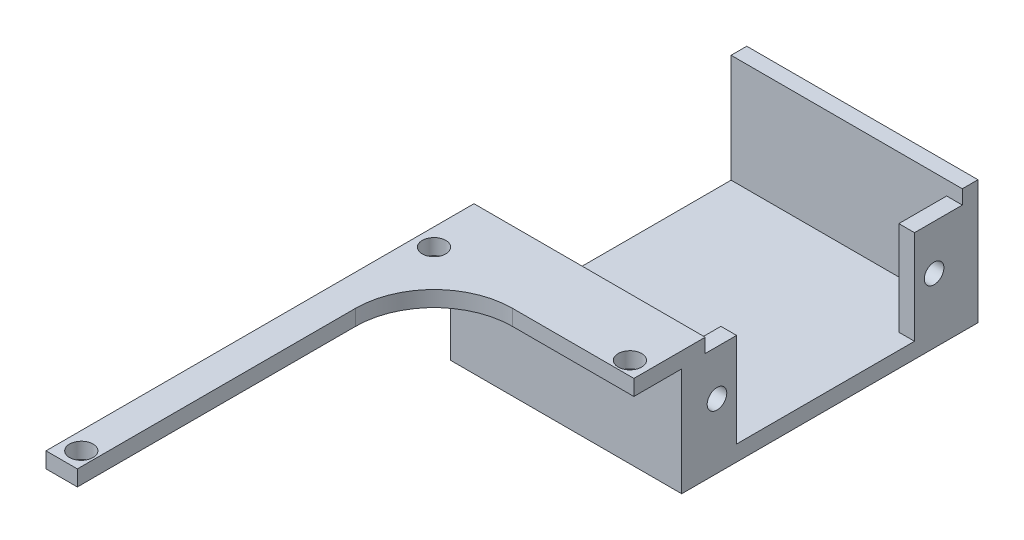
ISO-10303-21;
HEADER;
FILE_DESCRIPTION(('STEP AP214'),'2;1');
FILE_NAME('part.step','',(''),(''),'','','');
FILE_SCHEMA(('AUTOMOTIVE_DESIGN { 1 0 10303 214 1 1 1 1 }'));
ENDSEC;
DATA;
#1=APPLICATION_CONTEXT('core data for automotive mechanical design processes');
#2=APPLICATION_PROTOCOL_DEFINITION('international standard','automotive_design',2000,#1);
#3=PRODUCT_CONTEXT('',#1,'mechanical');
#4=PRODUCT('Part','Part','',(#3));
#5=PRODUCT_RELATED_PRODUCT_CATEGORY('part','',(#4));
#6=PRODUCT_DEFINITION_FORMATION('','',#4);
#7=PRODUCT_DEFINITION_CONTEXT('part definition',#1,'design');
#8=PRODUCT_DEFINITION('design','',#6,#7);
#9=PRODUCT_DEFINITION_SHAPE('','',#8);
#10=(LENGTH_UNIT() NAMED_UNIT(*) SI_UNIT(.MILLI.,.METRE.));
#11=(NAMED_UNIT(*) PLANE_ANGLE_UNIT() SI_UNIT($,.RADIAN.));
#12=(NAMED_UNIT(*) SI_UNIT($,.STERADIAN.) SOLID_ANGLE_UNIT());
#13=UNCERTAINTY_MEASURE_WITH_UNIT(LENGTH_MEASURE(1.E-05),#10,'distance_accuracy_value','');
#14=(GEOMETRIC_REPRESENTATION_CONTEXT(3) GLOBAL_UNCERTAINTY_ASSIGNED_CONTEXT((#13)) GLOBAL_UNIT_ASSIGNED_CONTEXT((#10,
#11,#12)) REPRESENTATION_CONTEXT('',''));
#15=CARTESIAN_POINT('',(0.,0.,0.));
#16=DIRECTION('',(0.,0.,1.));
#17=DIRECTION('',(1.,0.,0.));
#18=AXIS2_PLACEMENT_3D('',#15,#16,#17);
#19=CARTESIAN_POINT('',(-11.734375,-11.8,-56.7984375));
#20=DIRECTION('',(0.,-1.,0.));
#21=DIRECTION('',(0.,0.,-1.));
#22=AXIS2_PLACEMENT_3D('',#19,#20,#21);
#23=PLANE('',#22);
#24=DIRECTION('',(0.,0.,1.));
#25=VECTOR('',#24,1.);
#26=CARTESIAN_POINT('',(-13.734375,-11.8,-54.7984375));
#27=LINE('',#26,#25);
#28=CARTESIAN_POINT('',(-13.734375,-11.8,-54.7984375));
#29=VERTEX_POINT('',#28);
#30=CARTESIAN_POINT('',(-13.734375,-11.8,-48.6984375));
#31=VERTEX_POINT('',#30);
#32=EDGE_CURVE('E230',#29,#31,#27,.T.);
#33=ORIENTED_EDGE('',*,*,#32,.F.);
#34=DIRECTION('',(1.,0.,0.));
#35=VECTOR('',#34,1.);
#36=CARTESIAN_POINT('',(-41.234375,-11.8,-54.7984375));
#37=LINE('',#36,#35);
#38=CARTESIAN_POINT('',(-41.234375,-11.8,-54.7984375));
#39=VERTEX_POINT('',#38);
#40=EDGE_CURVE('E203',#39,#29,#37,.T.);
#41=ORIENTED_EDGE('',*,*,#40,.F.);
#42=DIRECTION('',(0.,0.,1.));
#43=VECTOR('',#42,1.);
#44=CARTESIAN_POINT('',(-41.234375,-11.8,-56.7984375));
#45=LINE('',#44,#43);
#46=CARTESIAN_POINT('',(-41.234375,-11.8,-21.9984375));
#47=VERTEX_POINT('',#46);
#48=EDGE_CURVE('E313',#39,#47,#45,.T.);
#49=ORIENTED_EDGE('',*,*,#48,.T.);
#50=DIRECTION('',(1.,0.,0.));
#51=VECTOR('',#50,1.);
#52=CARTESIAN_POINT('',(-11.734375,-11.8,-21.9984375));
#53=LINE('',#52,#51);
#54=CARTESIAN_POINT('',(-13.734375,-11.8,-21.9984375));
#55=VERTEX_POINT('',#54);
#56=EDGE_CURVE('E296',#47,#55,#53,.T.);
#57=ORIENTED_EDGE('',*,*,#56,.T.);
#58=DIRECTION('',(0.,0.,1.));
#59=VECTOR('',#58,1.);
#60=CARTESIAN_POINT('',(-13.734375,-11.8,-21.9984375));
#61=LINE('',#60,#59);
#62=CARTESIAN_POINT('',(-13.734375,-11.8,-25.9984375));
#63=VERTEX_POINT('',#62);
#64=EDGE_CURVE('E245',#63,#55,#61,.T.);
#65=ORIENTED_EDGE('',*,*,#64,.F.);
#66=DIRECTION('',(-1.,0.,0.));
#67=VECTOR('',#66,1.);
#68=CARTESIAN_POINT('',(-11.734375,-11.8,-25.9984375));
#69=LINE('',#68,#67);
#70=CARTESIAN_POINT('',(-11.734375,-11.8,-25.9984375));
#71=VERTEX_POINT('',#70);
#72=EDGE_CURVE('E207',#71,#63,#69,.T.);
#73=ORIENTED_EDGE('',*,*,#72,.F.);
#74=DIRECTION('',(0.,0.,1.));
#75=VECTOR('',#74,1.);
#76=CARTESIAN_POINT('',(-11.734375,-11.8,-56.7984375));
#77=LINE('',#76,#75);
#78=CARTESIAN_POINT('',(-11.734375,-11.8,-48.6984375));
#79=VERTEX_POINT('',#78);
#80=EDGE_CURVE('E88',#79,#71,#77,.T.);
#81=ORIENTED_EDGE('',*,*,#80,.F.);
#82=DIRECTION('',(1.,0.,0.));
#83=VECTOR('',#82,1.);
#84=CARTESIAN_POINT('',(-11.734375,-11.8,-48.6984375));
#85=LINE('',#84,#83);
#86=EDGE_CURVE('E83',#31,#79,#85,.T.);
#87=ORIENTED_EDGE('',*,*,#86,.F.);
#88=EDGE_LOOP('',(#33,#41,#49,#57,#65,#73,#81,#87));
#89=FACE_BOUND('',#88,.T.);
#90=ADVANCED_FACE('F65',(#89),#23,.F.);
#91=CARTESIAN_POINT('',(-41.234375,2.,-54.7984375));
#92=DIRECTION('',(0.,0.,-1.));
#93=DIRECTION('',(-1.,0.,0.));
#94=AXIS2_PLACEMENT_3D('',#91,#92,#93);
#95=PLANE('',#94);
#96=DIRECTION('',(0.,-1.,0.));
#97=VECTOR('',#96,1.);
#98=CARTESIAN_POINT('',(-13.734375,0.200000000000001,-54.7984375));
#99=LINE('',#98,#97);
#100=CARTESIAN_POINT('',(-13.734375,0.200000000000001,-54.7984375));
#101=VERTEX_POINT('',#100);
#102=EDGE_CURVE('E196',#101,#29,#99,.T.);
#103=ORIENTED_EDGE('',*,*,#102,.F.);
#104=DIRECTION('',(-1.,0.,0.));
#105=VECTOR('',#104,1.);
#106=CARTESIAN_POINT('',(-11.734375,0.200000000000001,-54.7984375));
#107=LINE('',#106,#105);
#108=CARTESIAN_POINT('',(-11.734375,0.200000000000001,-54.7984375));
#109=VERTEX_POINT('',#108);
#110=EDGE_CURVE('E200',#109,#101,#107,.T.);
#111=ORIENTED_EDGE('',*,*,#110,.F.);
#112=DIRECTION('',(0.,-1.,0.));
#113=VECTOR('',#112,1.);
#114=CARTESIAN_POINT('',(-11.734375,2.,-54.7984375));
#115=LINE('',#114,#113);
#116=CARTESIAN_POINT('',(-11.734375,2.,-54.7984375));
#117=VERTEX_POINT('',#116);
#118=EDGE_CURVE('E288',#117,#109,#115,.T.);
#119=ORIENTED_EDGE('',*,*,#118,.F.);
#120=DIRECTION('',(1.,0.,0.));
#121=VECTOR('',#120,1.);
#122=CARTESIAN_POINT('',(-41.234375,2.,-54.7984375));
#123=LINE('',#122,#121);
#124=CARTESIAN_POINT('',(-41.234375,2.,-54.7984375));
#125=VERTEX_POINT('',#124);
#126=EDGE_CURVE('E277',#125,#117,#123,.T.);
#127=ORIENTED_EDGE('',*,*,#126,.F.);
#128=DIRECTION('',(0.,-1.,0.));
#129=VECTOR('',#128,1.);
#130=CARTESIAN_POINT('',(-41.234375,2.,-54.7984375));
#131=LINE('',#130,#129);
#132=EDGE_CURVE('E293',#125,#39,#131,.T.);
#133=ORIENTED_EDGE('',*,*,#132,.T.);
#134=ORIENTED_EDGE('',*,*,#40,.T.);
#135=EDGE_LOOP('',(#103,#111,#119,#127,#133,#134));
#136=FACE_BOUND('',#135,.T.);
#137=ADVANCED_FACE('F198',(#136),#95,.F.);
#138=CARTESIAN_POINT('',(0.,0.,-21.9984375));
#139=DIRECTION('',(0.,0.,-1.));
#140=DIRECTION('',(-1.,0.,0.));
#141=AXIS2_PLACEMENT_3D('',#138,#139,#140);
#142=PLANE('',#141);
#143=DIRECTION('',(1.,0.,0.));
#144=VECTOR('',#143,1.);
#145=CARTESIAN_POINT('',(-11.734375,0.200000000000001,-21.9984375));
#146=LINE('',#145,#144);
#147=CARTESIAN_POINT('',(-13.734375,0.200000000000001,-21.9984375));
#148=VERTEX_POINT('',#147);
#149=CARTESIAN_POINT('',(-11.734375,0.200000000000001,-21.9984375));
#150=VERTEX_POINT('',#149);
#151=EDGE_CURVE('E252',#148,#150,#146,.T.);
#152=ORIENTED_EDGE('',*,*,#151,.F.);
#153=DIRECTION('',(0.,-1.,0.));
#154=VECTOR('',#153,1.);
#155=CARTESIAN_POINT('',(-13.734375,0.200000000000001,-21.9984375));
#156=LINE('',#155,#154);
#157=EDGE_CURVE('E256',#148,#55,#156,.T.);
#158=ORIENTED_EDGE('',*,*,#157,.T.);
#159=ORIENTED_EDGE('',*,*,#56,.F.);
#160=DIRECTION('',(0.,1.,0.));
#161=VECTOR('',#160,1.);
#162=CARTESIAN_POINT('',(-41.234375,0.,-21.9984375));
#163=LINE('',#162,#161);
#164=CARTESIAN_POINT('',(-41.234375,2.,-21.9984375));
#165=VERTEX_POINT('',#164);
#166=EDGE_CURVE('E341',#47,#165,#163,.T.);
#167=ORIENTED_EDGE('',*,*,#166,.T.);
#168=DIRECTION('',(1.,0.,0.));
#169=VECTOR('',#168,1.);
#170=CARTESIAN_POINT('',(-41.234375,2.,-21.9984375));
#171=LINE('',#170,#169);
#172=CARTESIAN_POINT('',(-11.734375,2.,-21.9984375));
#173=VERTEX_POINT('',#172);
#174=EDGE_CURVE('E344',#165,#173,#171,.T.);
#175=ORIENTED_EDGE('',*,*,#174,.T.);
#176=DIRECTION('',(0.,-1.,0.));
#177=VECTOR('',#176,1.);
#178=CARTESIAN_POINT('',(-11.734375,2.,-21.9984375));
#179=LINE('',#178,#177);
#180=EDGE_CURVE('E338',#173,#150,#179,.T.);
#181=ORIENTED_EDGE('',*,*,#180,.T.);
#182=EDGE_LOOP('',(#152,#158,#159,#167,#175,#181));
#183=FACE_BOUND('',#182,.T.);
#184=ADVANCED_FACE('F474',(#183),#142,.T.);
#185=CARTESIAN_POINT('',(0.,0.,0.));
#186=DIRECTION('',(0.,1.,0.));
#187=DIRECTION('',(0.,0.,1.));
#188=AXIS2_PLACEMENT_3D('',#185,#186,#187);
#189=PLANE('',#188);
#190=CARTESIAN_POINT('',(-13.984375,0.,-14.6484375));
#191=DIRECTION('',(0.,1.,0.));
#192=DIRECTION('',(0.,0.,1.));
#193=AXIS2_PLACEMENT_3D('',#190,#191,#192);
#194=CIRCLE('',#193,1.5);
#195=CARTESIAN_POINT('',(-13.984375,0.,-13.1484375));
#196=VERTEX_POINT('',#195);
#197=EDGE_CURVE('E366',#196,#196,#194,.T.);
#198=ORIENTED_EDGE('',*,*,#197,.T.);
#199=EDGE_LOOP('',(#198));
#200=FACE_BOUND('',#199,.T.);
#201=CARTESIAN_POINT('',(-38.984375,0.,-14.6484375));
#202=DIRECTION('',(0.,1.,0.));
#203=DIRECTION('',(0.,0.,1.));
#204=AXIS2_PLACEMENT_3D('',#201,#202,#203);
#205=CIRCLE('',#204,1.5);
#206=CARTESIAN_POINT('',(-38.984375,0.,-13.1484375));
#207=VERTEX_POINT('',#206);
#208=EDGE_CURVE('E358',#207,#207,#205,.T.);
#209=ORIENTED_EDGE('',*,*,#208,.T.);
#210=EDGE_LOOP('',(#209));
#211=FACE_BOUND('',#210,.T.);
#212=CARTESIAN_POINT('',(-38.984375,0.,30.3515625));
#213=DIRECTION('',(0.,1.,0.));
#214=DIRECTION('',(0.,0.,1.));
#215=AXIS2_PLACEMENT_3D('',#212,#213,#214);
#216=CIRCLE('',#215,1.5);
#217=CARTESIAN_POINT('',(-38.984375,0.,31.8515625));
#218=VERTEX_POINT('',#217);
#219=EDGE_CURVE('E349',#218,#218,#216,.T.);
#220=ORIENTED_EDGE('',*,*,#219,.T.);
#221=EDGE_LOOP('',(#220));
#222=FACE_BOUND('',#221,.T.);
#223=DIRECTION('',(-1.,0.,0.));
#224=VECTOR('',#223,1.);
#225=CARTESIAN_POINT('',(-11.734375,0.,-18.9984375));
#226=LINE('',#225,#224);
#227=CARTESIAN_POINT('',(-11.734375,0.,-18.9984375));
#228=VERTEX_POINT('',#227);
#229=CARTESIAN_POINT('',(-41.234375,0.,-18.9984375));
#230=VERTEX_POINT('',#229);
#231=EDGE_CURVE('E316',#228,#230,#226,.T.);
#232=ORIENTED_EDGE('',*,*,#231,.F.);
#233=DIRECTION('',(0.,0.,1.));
#234=VECTOR('',#233,1.);
#235=CARTESIAN_POINT('',(-11.734375,0.,0.));
#236=LINE('',#235,#234);
#237=CARTESIAN_POINT('',(-11.734375,0.,-12.8984375));
#238=VERTEX_POINT('',#237);
#239=EDGE_CURVE('E382',#228,#238,#236,.T.);
#240=ORIENTED_EDGE('',*,*,#239,.T.);
#241=DIRECTION('',(1.,0.,0.));
#242=VECTOR('',#241,1.);
#243=CARTESIAN_POINT('',(0.,0.,-12.8984375));
#244=LINE('',#243,#242);
#245=CARTESIAN_POINT('',(-27.234375,0.,-12.8984375));
#246=VERTEX_POINT('',#245);
#247=EDGE_CURVE('E378',#246,#238,#244,.T.);
#248=ORIENTED_EDGE('',*,*,#247,.F.);
#249=CARTESIAN_POINT('',(-27.234375,0.,-2.8984375));
#250=DIRECTION('',(0.,1.,0.));
#251=DIRECTION('',(0.,0.,1.));
#252=AXIS2_PLACEMENT_3D('',#249,#250,#251);
#253=CIRCLE('',#252,10.);
#254=CARTESIAN_POINT('',(-37.234375,0.,-2.8984375));
#255=VERTEX_POINT('',#254);
#256=EDGE_CURVE('E75',#246,#255,#253,.T.);
#257=ORIENTED_EDGE('',*,*,#256,.T.);
#258=DIRECTION('',(0.,0.,1.));
#259=VECTOR('',#258,1.);
#260=CARTESIAN_POINT('',(-37.234375,0.,-16.8984375));
#261=LINE('',#260,#259);
#262=CARTESIAN_POINT('',(-37.234375,0.,32.6015625));
#263=VERTEX_POINT('',#262);
#264=EDGE_CURVE('E408',#255,#263,#261,.T.);
#265=ORIENTED_EDGE('',*,*,#264,.T.);
#266=DIRECTION('',(1.,0.,0.));
#267=VECTOR('',#266,1.);
#268=CARTESIAN_POINT('',(-41.234375,0.,32.6015625));
#269=LINE('',#268,#267);
#270=CARTESIAN_POINT('',(-41.234375,0.,32.6015625));
#271=VERTEX_POINT('',#270);
#272=EDGE_CURVE('E353',#271,#263,#269,.T.);
#273=ORIENTED_EDGE('',*,*,#272,.F.);
#274=DIRECTION('',(0.,0.,1.));
#275=VECTOR('',#274,1.);
#276=CARTESIAN_POINT('',(-41.234375,0.,-16.8984375));
#277=LINE('',#276,#275);
#278=EDGE_CURVE('E398',#230,#271,#277,.T.);
#279=ORIENTED_EDGE('',*,*,#278,.F.);
#280=EDGE_LOOP('',(#232,#240,#248,#257,#265,#273,#279));
#281=FACE_BOUND('',#280,.T.);
#282=ADVANCED_FACE('F490',(#200,#211,#222,#281),#189,.F.);
#283=CARTESIAN_POINT('',(0.,2.,0.));
#284=DIRECTION('',(0.,1.,0.));
#285=DIRECTION('',(0.,0.,1.));
#286=AXIS2_PLACEMENT_3D('',#283,#284,#285);
#287=PLANE('',#286);
#288=CARTESIAN_POINT('',(-38.984375,2.,30.3515625));
#289=DIRECTION('',(0.,1.,0.));
#290=DIRECTION('',(0.,0.,1.));
#291=AXIS2_PLACEMENT_3D('',#288,#289,#290);
#292=CIRCLE('',#291,1.5);
#293=CARTESIAN_POINT('',(-38.984375,2.,31.8515625));
#294=VERTEX_POINT('',#293);
#295=EDGE_CURVE('E354',#294,#294,#292,.T.);
#296=ORIENTED_EDGE('',*,*,#295,.F.);
#297=EDGE_LOOP('',(#296));
#298=FACE_BOUND('',#297,.T.);
#299=CARTESIAN_POINT('',(-38.984375,2.,-14.6484375));
#300=DIRECTION('',(0.,1.,0.));
#301=DIRECTION('',(0.,0.,1.));
#302=AXIS2_PLACEMENT_3D('',#299,#300,#301);
#303=CIRCLE('',#302,1.5);
#304=CARTESIAN_POINT('',(-38.984375,2.,-13.1484375));
#305=VERTEX_POINT('',#304);
#306=EDGE_CURVE('E362',#305,#305,#303,.T.);
#307=ORIENTED_EDGE('',*,*,#306,.F.);
#308=EDGE_LOOP('',(#307));
#309=FACE_BOUND('',#308,.T.);
#310=CARTESIAN_POINT('',(-13.984375,2.,-14.6484375));
#311=DIRECTION('',(0.,1.,0.));
#312=DIRECTION('',(0.,0.,1.));
#313=AXIS2_PLACEMENT_3D('',#310,#311,#312);
#314=CIRCLE('',#313,1.5);
#315=CARTESIAN_POINT('',(-13.984375,2.,-13.1484375));
#316=VERTEX_POINT('',#315);
#317=EDGE_CURVE('E348',#316,#316,#314,.T.);
#318=ORIENTED_EDGE('',*,*,#317,.F.);
#319=EDGE_LOOP('',(#318));
#320=FACE_BOUND('',#319,.T.);
#321=DIRECTION('',(0.,0.,1.));
#322=VECTOR('',#321,1.);
#323=CARTESIAN_POINT('',(-11.734375,2.,0.));
#324=LINE('',#323,#322);
#325=CARTESIAN_POINT('',(-11.734375,2.,-12.8984375));
#326=VERTEX_POINT('',#325);
#327=EDGE_CURVE('E373',#173,#326,#324,.T.);
#328=ORIENTED_EDGE('',*,*,#327,.F.);
#329=ORIENTED_EDGE('',*,*,#174,.F.);
#330=DIRECTION('',(0.,0.,1.));
#331=VECTOR('',#330,1.);
#332=CARTESIAN_POINT('',(-41.234375,2.,-16.8984375));
#333=LINE('',#332,#331);
#334=CARTESIAN_POINT('',(-41.234375,2.,32.6015625));
#335=VERTEX_POINT('',#334);
#336=EDGE_CURVE('E401',#165,#335,#333,.T.);
#337=ORIENTED_EDGE('',*,*,#336,.T.);
#338=DIRECTION('',(1.,0.,0.));
#339=VECTOR('',#338,1.);
#340=CARTESIAN_POINT('',(-41.234375,2.,32.6015625));
#341=LINE('',#340,#339);
#342=CARTESIAN_POINT('',(-37.234375,2.,32.6015625));
#343=VERTEX_POINT('',#342);
#344=EDGE_CURVE('E393',#335,#343,#341,.T.);
#345=ORIENTED_EDGE('',*,*,#344,.T.);
#346=DIRECTION('',(0.,0.,1.));
#347=VECTOR('',#346,1.);
#348=CARTESIAN_POINT('',(-37.234375,2.,-16.8984375));
#349=LINE('',#348,#347);
#350=CARTESIAN_POINT('',(-37.234375,2.,-2.8984375));
#351=VERTEX_POINT('',#350);
#352=EDGE_CURVE('E397',#351,#343,#349,.T.);
#353=ORIENTED_EDGE('',*,*,#352,.F.);
#354=CARTESIAN_POINT('',(-27.234375,2.,-2.8984375));
#355=DIRECTION('',(0.,1.,0.));
#356=DIRECTION('',(0.,0.,1.));
#357=AXIS2_PLACEMENT_3D('',#354,#355,#356);
#358=CIRCLE('',#357,10.);
#359=CARTESIAN_POINT('',(-27.234375,2.,-12.8984375));
#360=VERTEX_POINT('',#359);
#361=EDGE_CURVE('E12',#351,#360,#358,.F.);
#362=ORIENTED_EDGE('',*,*,#361,.T.);
#363=DIRECTION('',(1.,0.,0.));
#364=VECTOR('',#363,1.);
#365=CARTESIAN_POINT('',(0.,2.,-12.8984375));
#366=LINE('',#365,#364);
#367=EDGE_CURVE('E377',#360,#326,#366,.T.);
#368=ORIENTED_EDGE('',*,*,#367,.T.);
#369=EDGE_LOOP('',(#328,#329,#337,#345,#353,#362,#368));
#370=FACE_BOUND('',#369,.T.);
#371=ADVANCED_FACE('F453',(#298,#309,#320,#370),#287,.T.);
#372=CARTESIAN_POINT('',(-11.734375,2.,0.));
#373=DIRECTION('',(1.,0.,0.));
#374=DIRECTION('',(0.,0.,-1.));
#375=AXIS2_PLACEMENT_3D('',#372,#373,#374);
#376=PLANE('',#375);
#377=CARTESIAN_POINT('',(-11.734375,-5.55,-23.4984375));
#378=DIRECTION('',(1.,0.,0.));
#379=DIRECTION('',(0.,0.,-1.));
#380=AXIS2_PLACEMENT_3D('',#377,#378,#379);
#381=CIRCLE('',#380,1.25);
#382=CARTESIAN_POINT('',(-11.734375,-5.55,-24.7484375));
#383=VERTEX_POINT('',#382);
#384=EDGE_CURVE('E429',#383,#383,#381,.T.);
#385=ORIENTED_EDGE('',*,*,#384,.F.);
#386=EDGE_LOOP('',(#385));
#387=FACE_BOUND('',#386,.T.);
#388=CARTESIAN_POINT('',(-11.734375,-5.55,-51.1984375));
#389=DIRECTION('',(1.,0.,0.));
#390=DIRECTION('',(0.,0.,-1.));
#391=AXIS2_PLACEMENT_3D('',#388,#389,#390);
#392=CIRCLE('',#391,1.25);
#393=CARTESIAN_POINT('',(-11.734375,-5.55,-52.4484375));
#394=VERTEX_POINT('',#393);
#395=EDGE_CURVE('E436',#394,#394,#392,.T.);
#396=ORIENTED_EDGE('',*,*,#395,.F.);
#397=EDGE_LOOP('',(#396));
#398=FACE_BOUND('',#397,.T.);
#399=DIRECTION('',(0.,-1.,0.));
#400=VECTOR('',#399,1.);
#401=CARTESIAN_POINT('',(-11.734375,0.200000000000001,-48.6984375));
#402=LINE('',#401,#400);
#403=CARTESIAN_POINT('',(-11.734375,0.200000000000001,-48.6984375));
#404=VERTEX_POINT('',#403);
#405=EDGE_CURVE('E226',#404,#79,#402,.T.);
#406=ORIENTED_EDGE('',*,*,#405,.T.);
#407=ORIENTED_EDGE('',*,*,#80,.T.);
#408=DIRECTION('',(0.,-1.,0.));
#409=VECTOR('',#408,1.);
#410=CARTESIAN_POINT('',(-11.734375,0.200000000000001,-25.9984375));
#411=LINE('',#410,#409);
#412=CARTESIAN_POINT('',(-11.734375,0.200000000000001,-25.9984375));
#413=VERTEX_POINT('',#412);
#414=EDGE_CURVE('E269',#413,#71,#411,.T.);
#415=ORIENTED_EDGE('',*,*,#414,.F.);
#416=DIRECTION('',(0.,0.,-1.));
#417=VECTOR('',#416,1.);
#418=CARTESIAN_POINT('',(-11.734375,0.200000000000001,-21.9984375));
#419=LINE('',#418,#417);
#420=EDGE_CURVE('E240',#150,#413,#419,.T.);
#421=ORIENTED_EDGE('',*,*,#420,.F.);
#422=ORIENTED_EDGE('',*,*,#180,.F.);
#423=ORIENTED_EDGE('',*,*,#327,.T.);
#424=DIRECTION('',(0.,-1.,0.));
#425=VECTOR('',#424,1.);
#426=CARTESIAN_POINT('',(-11.734375,2.,-12.8984375));
#427=LINE('',#426,#425);
#428=EDGE_CURVE('E381',#326,#238,#427,.T.);
#429=ORIENTED_EDGE('',*,*,#428,.T.);
#430=ORIENTED_EDGE('',*,*,#239,.F.);
#431=DIRECTION('',(0.,1.,0.));
#432=VECTOR('',#431,1.);
#433=CARTESIAN_POINT('',(-11.734375,-13.8,-18.9984375));
#434=LINE('',#433,#432);
#435=CARTESIAN_POINT('',(-11.734375,-13.8,-18.9984375));
#436=VERTEX_POINT('',#435);
#437=EDGE_CURVE('E334',#436,#228,#434,.T.);
#438=ORIENTED_EDGE('',*,*,#437,.F.);
#439=DIRECTION('',(0.,0.,1.));
#440=VECTOR('',#439,1.);
#441=CARTESIAN_POINT('',(-11.734375,-13.8,-21.9984375));
#442=LINE('',#441,#440);
#443=CARTESIAN_POINT('',(-11.734375,-13.8,-56.7984375));
#444=VERTEX_POINT('',#443);
#445=EDGE_CURVE('E317',#444,#436,#442,.T.);
#446=ORIENTED_EDGE('',*,*,#445,.F.);
#447=DIRECTION('',(0.,-1.,0.));
#448=VECTOR('',#447,1.);
#449=CARTESIAN_POINT('',(-11.734375,-11.8,-56.7984375));
#450=LINE('',#449,#448);
#451=CARTESIAN_POINT('',(-11.734375,2.,-56.7984375));
#452=VERTEX_POINT('',#451);
#453=EDGE_CURVE('E297',#452,#444,#450,.T.);
#454=ORIENTED_EDGE('',*,*,#453,.F.);
#455=DIRECTION('',(0.,0.,-1.));
#456=VECTOR('',#455,1.);
#457=CARTESIAN_POINT('',(-11.734375,2.,-56.7984375));
#458=LINE('',#457,#456);
#459=EDGE_CURVE('E280',#117,#452,#458,.T.);
#460=ORIENTED_EDGE('',*,*,#459,.F.);
#461=ORIENTED_EDGE('',*,*,#118,.T.);
#462=DIRECTION('',(0.,0.,-1.));
#463=VECTOR('',#462,1.);
#464=CARTESIAN_POINT('',(-11.734375,0.200000000000001,-54.7984375));
#465=LINE('',#464,#463);
#466=EDGE_CURVE('E216',#404,#109,#465,.T.);
#467=ORIENTED_EDGE('',*,*,#466,.F.);
#468=EDGE_LOOP('',(#406,#407,#415,#421,#422,#423,#429,#430,#438,#446,#454,#460,#461,#467));
#469=FACE_BOUND('',#468,.T.);
#470=ADVANCED_FACE('F449',(#387,#398,#469),#376,.T.);
#471=CARTESIAN_POINT('',(0.,2.,-12.8984375));
#472=DIRECTION('',(0.,0.,-1.));
#473=DIRECTION('',(-1.,0.,0.));
#474=AXIS2_PLACEMENT_3D('',#471,#472,#473);
#475=PLANE('',#474);
#476=ORIENTED_EDGE('',*,*,#367,.F.);
#477=DIRECTION('',(0.,-1.,0.));
#478=VECTOR('',#477,1.);
#479=CARTESIAN_POINT('',(-27.234375,2.,-12.8984375));
#480=LINE('',#479,#478);
#481=EDGE_CURVE('E392',#360,#246,#480,.T.);
#482=ORIENTED_EDGE('',*,*,#481,.T.);
#483=ORIENTED_EDGE('',*,*,#247,.T.);
#484=ORIENTED_EDGE('',*,*,#428,.F.);
#485=EDGE_LOOP('',(#476,#482,#483,#484));
#486=FACE_BOUND('',#485,.T.);
#487=ADVANCED_FACE('F452',(#486),#475,.F.);
#488=CARTESIAN_POINT('',(-41.234375,2.,-16.8984375));
#489=DIRECTION('',(1.,0.,0.));
#490=DIRECTION('',(0.,0.,-1.));
#491=AXIS2_PLACEMENT_3D('',#488,#489,#490);
#492=PLANE('',#491);
#493=ORIENTED_EDGE('',*,*,#166,.F.);
#494=ORIENTED_EDGE('',*,*,#48,.F.);
#495=ORIENTED_EDGE('',*,*,#132,.F.);
#496=DIRECTION('',(0.,0.,1.));
#497=VECTOR('',#496,1.);
#498=CARTESIAN_POINT('',(-41.234375,2.,-56.7984375));
#499=LINE('',#498,#497);
#500=CARTESIAN_POINT('',(-41.234375,2.,-56.7984375));
#501=VERTEX_POINT('',#500);
#502=EDGE_CURVE('E273',#501,#125,#499,.T.);
#503=ORIENTED_EDGE('',*,*,#502,.F.);
#504=DIRECTION('',(0.,1.,0.));
#505=VECTOR('',#504,1.);
#506=CARTESIAN_POINT('',(-41.234375,-11.8,-56.7984375));
#507=LINE('',#506,#505);
#508=CARTESIAN_POINT('',(-41.234375,-13.8,-56.7984375));
#509=VERTEX_POINT('',#508);
#510=EDGE_CURVE('E305',#509,#501,#507,.T.);
#511=ORIENTED_EDGE('',*,*,#510,.F.);
#512=DIRECTION('',(0.,0.,-1.));
#513=VECTOR('',#512,1.);
#514=CARTESIAN_POINT('',(-41.234375,-13.8,-21.9984375));
#515=LINE('',#514,#513);
#516=CARTESIAN_POINT('',(-41.234375,-13.8,-18.9984375));
#517=VERTEX_POINT('',#516);
#518=EDGE_CURVE('E324',#517,#509,#515,.T.);
#519=ORIENTED_EDGE('',*,*,#518,.F.);
#520=DIRECTION('',(0.,1.,0.));
#521=VECTOR('',#520,1.);
#522=CARTESIAN_POINT('',(-41.234375,-13.8,-18.9984375));
#523=LINE('',#522,#521);
#524=EDGE_CURVE('E327',#517,#230,#523,.T.);
#525=ORIENTED_EDGE('',*,*,#524,.T.);
#526=ORIENTED_EDGE('',*,*,#278,.T.);
#527=DIRECTION('',(0.,-1.,0.));
#528=VECTOR('',#527,1.);
#529=CARTESIAN_POINT('',(-41.234375,2.,32.6015625));
#530=LINE('',#529,#528);
#531=EDGE_CURVE('E404',#335,#271,#530,.T.);
#532=ORIENTED_EDGE('',*,*,#531,.F.);
#533=ORIENTED_EDGE('',*,*,#336,.F.);
#534=EDGE_LOOP('',(#493,#494,#495,#503,#511,#519,#525,#526,#532,#533));
#535=FACE_BOUND('',#534,.T.);
#536=ADVANCED_FACE('F510',(#535),#492,.F.);
#537=CARTESIAN_POINT('',(-41.234375,2.,32.6015625));
#538=DIRECTION('',(0.,0.,-1.));
#539=DIRECTION('',(-1.,0.,0.));
#540=AXIS2_PLACEMENT_3D('',#537,#538,#539);
#541=PLANE('',#540);
#542=ORIENTED_EDGE('',*,*,#272,.T.);
#543=DIRECTION('',(0.,-1.,0.));
#544=VECTOR('',#543,1.);
#545=CARTESIAN_POINT('',(-37.234375,2.,32.6015625));
#546=LINE('',#545,#544);
#547=EDGE_CURVE('E385',#343,#263,#546,.T.);
#548=ORIENTED_EDGE('',*,*,#547,.F.);
#549=ORIENTED_EDGE('',*,*,#344,.F.);
#550=ORIENTED_EDGE('',*,*,#531,.T.);
#551=EDGE_LOOP('',(#542,#548,#549,#550));
#552=FACE_BOUND('',#551,.T.);
#553=ADVANCED_FACE('F516',(#552),#541,.F.);
#554=CARTESIAN_POINT('',(-37.234375,2.,-16.8984375));
#555=DIRECTION('',(1.,0.,0.));
#556=DIRECTION('',(0.,0.,-1.));
#557=AXIS2_PLACEMENT_3D('',#554,#555,#556);
#558=PLANE('',#557);
#559=ORIENTED_EDGE('',*,*,#264,.F.);
#560=DIRECTION('',(0.,-1.,0.));
#561=VECTOR('',#560,1.);
#562=CARTESIAN_POINT('',(-37.234375,2.,-2.8984375));
#563=LINE('',#562,#561);
#564=EDGE_CURVE('E422',#255,#351,#563,.F.);
#565=ORIENTED_EDGE('',*,*,#564,.T.);
#566=ORIENTED_EDGE('',*,*,#352,.T.);
#567=ORIENTED_EDGE('',*,*,#547,.T.);
#568=EDGE_LOOP('',(#559,#565,#566,#567));
#569=FACE_BOUND('',#568,.T.);
#570=ADVANCED_FACE('F512',(#569),#558,.T.);
#571=CARTESIAN_POINT('',(-27.234375,2.,-2.8984375));
#572=DIRECTION('',(0.,-1.,0.));
#573=DIRECTION('',(0.,0.,-1.));
#574=AXIS2_PLACEMENT_3D('',#571,#572,#573);
#575=CYLINDRICAL_SURFACE('',#574,10.);
#576=ORIENTED_EDGE('',*,*,#361,.F.);
#577=ORIENTED_EDGE('',*,*,#564,.F.);
#578=ORIENTED_EDGE('',*,*,#256,.F.);
#579=ORIENTED_EDGE('',*,*,#481,.F.);
#580=EDGE_LOOP('',(#576,#577,#578,#579));
#581=FACE_BOUND('',#580,.T.);
#582=ADVANCED_FACE('F67',(#581),#575,.F.);
#583=CARTESIAN_POINT('',(-13.984375,0.,-14.6484375));
#584=DIRECTION('',(0.,1.,0.));
#585=DIRECTION('',(0.,0.,1.));
#586=AXIS2_PLACEMENT_3D('',#583,#584,#585);
#587=CYLINDRICAL_SURFACE('',#586,1.5);
#588=ORIENTED_EDGE('',*,*,#197,.F.);
#589=EDGE_LOOP('',(#588));
#590=FACE_BOUND('',#589,.T.);
#591=ORIENTED_EDGE('',*,*,#317,.T.);
#592=EDGE_LOOP('',(#591));
#593=FACE_BOUND('',#592,.T.);
#594=ADVANCED_FACE('F498',(#590,#593),#587,.F.);
#595=CARTESIAN_POINT('',(-38.984375,0.,-14.6484375));
#596=DIRECTION('',(0.,1.,0.));
#597=DIRECTION('',(0.,0.,1.));
#598=AXIS2_PLACEMENT_3D('',#595,#596,#597);
#599=CYLINDRICAL_SURFACE('',#598,1.5);
#600=ORIENTED_EDGE('',*,*,#208,.F.);
#601=EDGE_LOOP('',(#600));
#602=FACE_BOUND('',#601,.T.);
#603=ORIENTED_EDGE('',*,*,#306,.T.);
#604=EDGE_LOOP('',(#603));
#605=FACE_BOUND('',#604,.T.);
#606=ADVANCED_FACE('F494',(#602,#605),#599,.F.);
#607=CARTESIAN_POINT('',(-38.984375,0.,30.3515625));
#608=DIRECTION('',(0.,1.,0.));
#609=DIRECTION('',(0.,0.,1.));
#610=AXIS2_PLACEMENT_3D('',#607,#608,#609);
#611=CYLINDRICAL_SURFACE('',#610,1.5);
#612=ORIENTED_EDGE('',*,*,#219,.F.);
#613=EDGE_LOOP('',(#612));
#614=FACE_BOUND('',#613,.T.);
#615=ORIENTED_EDGE('',*,*,#295,.T.);
#616=EDGE_LOOP('',(#615));
#617=FACE_BOUND('',#616,.T.);
#618=ADVANCED_FACE('F486',(#614,#617),#611,.F.);
#619=CARTESIAN_POINT('',(-11.734375,-13.8,-18.9984375));
#620=DIRECTION('',(0.,0.,-1.));
#621=DIRECTION('',(-1.,0.,0.));
#622=AXIS2_PLACEMENT_3D('',#619,#620,#621);
#623=PLANE('',#622);
#624=ORIENTED_EDGE('',*,*,#231,.T.);
#625=ORIENTED_EDGE('',*,*,#524,.F.);
#626=DIRECTION('',(-1.,0.,0.));
#627=VECTOR('',#626,1.);
#628=CARTESIAN_POINT('',(-11.734375,-13.8,-18.9984375));
#629=LINE('',#628,#627);
#630=EDGE_CURVE('E321',#436,#517,#629,.T.);
#631=ORIENTED_EDGE('',*,*,#630,.F.);
#632=ORIENTED_EDGE('',*,*,#437,.T.);
#633=EDGE_LOOP('',(#624,#625,#631,#632));
#634=FACE_BOUND('',#633,.T.);
#635=ADVANCED_FACE('F482',(#634),#623,.F.);
#636=CARTESIAN_POINT('',(0.,-13.8,0.));
#637=DIRECTION('',(0.,-1.,0.));
#638=DIRECTION('',(0.,0.,-1.));
#639=AXIS2_PLACEMENT_3D('',#636,#637,#638);
#640=PLANE('',#639);
#641=ORIENTED_EDGE('',*,*,#445,.T.);
#642=ORIENTED_EDGE('',*,*,#630,.T.);
#643=ORIENTED_EDGE('',*,*,#518,.T.);
#644=DIRECTION('',(-1.,0.,0.));
#645=VECTOR('',#644,1.);
#646=CARTESIAN_POINT('',(-11.734375,-13.8,-56.7984375));
#647=LINE('',#646,#645);
#648=EDGE_CURVE('E301',#444,#509,#647,.T.);
#649=ORIENTED_EDGE('',*,*,#648,.F.);
#650=EDGE_LOOP('',(#641,#642,#643,#649));
#651=FACE_BOUND('',#650,.T.);
#652=ADVANCED_FACE('F479',(#651),#640,.T.);
#653=CARTESIAN_POINT('',(0.,0.,-56.7984375));
#654=DIRECTION('',(0.,0.,-1.));
#655=DIRECTION('',(-1.,0.,0.));
#656=AXIS2_PLACEMENT_3D('',#653,#654,#655);
#657=PLANE('',#656);
#658=ORIENTED_EDGE('',*,*,#453,.T.);
#659=ORIENTED_EDGE('',*,*,#648,.T.);
#660=ORIENTED_EDGE('',*,*,#510,.T.);
#661=DIRECTION('',(-1.,0.,0.));
#662=VECTOR('',#661,1.);
#663=CARTESIAN_POINT('',(-41.234375,2.,-56.7984375));
#664=LINE('',#663,#662);
#665=EDGE_CURVE('E284',#452,#501,#664,.T.);
#666=ORIENTED_EDGE('',*,*,#665,.F.);
#667=EDGE_LOOP('',(#658,#659,#660,#666));
#668=FACE_BOUND('',#667,.T.);
#669=ADVANCED_FACE('F478',(#668),#657,.T.);
#670=CARTESIAN_POINT('',(0.,2.,0.));
#671=DIRECTION('',(0.,1.,0.));
#672=DIRECTION('',(0.,0.,1.));
#673=AXIS2_PLACEMENT_3D('',#670,#671,#672);
#674=PLANE('',#673);
#675=ORIENTED_EDGE('',*,*,#502,.T.);
#676=ORIENTED_EDGE('',*,*,#126,.T.);
#677=ORIENTED_EDGE('',*,*,#459,.T.);
#678=ORIENTED_EDGE('',*,*,#665,.T.);
#679=EDGE_LOOP('',(#675,#676,#677,#678));
#680=FACE_BOUND('',#679,.T.);
#681=ADVANCED_FACE('F560',(#680),#674,.T.);
#682=CARTESIAN_POINT('',(-11.734375,0.200000000000001,-25.9984375));
#683=DIRECTION('',(0.,0.,1.));
#684=DIRECTION('',(1.,0.,0.));
#685=AXIS2_PLACEMENT_3D('',#682,#683,#684);
#686=PLANE('',#685);
#687=ORIENTED_EDGE('',*,*,#72,.T.);
#688=DIRECTION('',(0.,-1.,0.));
#689=VECTOR('',#688,1.);
#690=CARTESIAN_POINT('',(-13.734375,0.200000000000001,-25.9984375));
#691=LINE('',#690,#689);
#692=CARTESIAN_POINT('',(-13.734375,0.200000000000001,-25.9984375));
#693=VERTEX_POINT('',#692);
#694=EDGE_CURVE('E265',#693,#63,#691,.T.);
#695=ORIENTED_EDGE('',*,*,#694,.F.);
#696=DIRECTION('',(-1.,0.,0.));
#697=VECTOR('',#696,1.);
#698=CARTESIAN_POINT('',(-11.734375,0.200000000000001,-25.9984375));
#699=LINE('',#698,#697);
#700=EDGE_CURVE('E244',#413,#693,#699,.T.);
#701=ORIENTED_EDGE('',*,*,#700,.F.);
#702=ORIENTED_EDGE('',*,*,#414,.T.);
#703=EDGE_LOOP('',(#687,#695,#701,#702));
#704=FACE_BOUND('',#703,.T.);
#705=ADVANCED_FACE('F558',(#704),#686,.F.);
#706=CARTESIAN_POINT('',(-13.734375,0.200000000000001,-21.9984375));
#707=DIRECTION('',(1.,0.,0.));
#708=DIRECTION('',(0.,0.,-1.));
#709=AXIS2_PLACEMENT_3D('',#706,#707,#708);
#710=PLANE('',#709);
#711=CARTESIAN_POINT('',(-13.734375,-5.55,-23.4984375));
#712=DIRECTION('',(1.,0.,0.));
#713=DIRECTION('',(0.,0.,-1.));
#714=AXIS2_PLACEMENT_3D('',#711,#712,#713);
#715=CIRCLE('',#714,1.25);
#716=CARTESIAN_POINT('',(-13.734375,-5.55,-24.7484375));
#717=VERTEX_POINT('',#716);
#718=EDGE_CURVE('E69',#717,#717,#715,.T.);
#719=ORIENTED_EDGE('',*,*,#718,.T.);
#720=EDGE_LOOP('',(#719));
#721=FACE_BOUND('',#720,.T.);
#722=ORIENTED_EDGE('',*,*,#64,.T.);
#723=ORIENTED_EDGE('',*,*,#157,.F.);
#724=DIRECTION('',(0.,0.,1.));
#725=VECTOR('',#724,1.);
#726=CARTESIAN_POINT('',(-13.734375,0.200000000000001,-21.9984375));
#727=LINE('',#726,#725);
#728=EDGE_CURVE('E248',#693,#148,#727,.T.);
#729=ORIENTED_EDGE('',*,*,#728,.F.);
#730=ORIENTED_EDGE('',*,*,#694,.T.);
#731=EDGE_LOOP('',(#722,#723,#729,#730));
#732=FACE_BOUND('',#731,.T.);
#733=ADVANCED_FACE('F556',(#721,#732),#710,.F.);
#734=CARTESIAN_POINT('',(0.,0.200000000000001,0.));
#735=DIRECTION('',(0.,1.,0.));
#736=DIRECTION('',(0.,0.,1.));
#737=AXIS2_PLACEMENT_3D('',#734,#735,#736);
#738=PLANE('',#737);
#739=ORIENTED_EDGE('',*,*,#420,.T.);
#740=ORIENTED_EDGE('',*,*,#700,.T.);
#741=ORIENTED_EDGE('',*,*,#728,.T.);
#742=ORIENTED_EDGE('',*,*,#151,.T.);
#743=EDGE_LOOP('',(#739,#740,#741,#742));
#744=FACE_BOUND('',#743,.T.);
#745=ADVANCED_FACE('F467',(#744),#738,.T.);
#746=CARTESIAN_POINT('',(-13.734375,0.200000000000001,-54.7984375));
#747=DIRECTION('',(1.,0.,0.));
#748=DIRECTION('',(0.,0.,-1.));
#749=AXIS2_PLACEMENT_3D('',#746,#747,#748);
#750=PLANE('',#749);
#751=CARTESIAN_POINT('',(-13.734375,-5.55,-51.1984375));
#752=DIRECTION('',(1.,0.,0.));
#753=DIRECTION('',(0.,0.,-1.));
#754=AXIS2_PLACEMENT_3D('',#751,#752,#753);
#755=CIRCLE('',#754,1.25);
#756=CARTESIAN_POINT('',(-13.734375,-5.55,-52.4484375));
#757=VERTEX_POINT('',#756);
#758=EDGE_CURVE('E426',#757,#757,#755,.T.);
#759=ORIENTED_EDGE('',*,*,#758,.T.);
#760=EDGE_LOOP('',(#759));
#761=FACE_BOUND('',#760,.T.);
#762=ORIENTED_EDGE('',*,*,#32,.T.);
#763=DIRECTION('',(0.,-1.,0.));
#764=VECTOR('',#763,1.);
#765=CARTESIAN_POINT('',(-13.734375,0.200000000000001,-48.6984375));
#766=LINE('',#765,#764);
#767=CARTESIAN_POINT('',(-13.734375,0.200000000000001,-48.6984375));
#768=VERTEX_POINT('',#767);
#769=EDGE_CURVE('E208',#768,#31,#766,.T.);
#770=ORIENTED_EDGE('',*,*,#769,.F.);
#771=DIRECTION('',(0.,0.,1.));
#772=VECTOR('',#771,1.);
#773=CARTESIAN_POINT('',(-13.734375,0.200000000000001,-54.7984375));
#774=LINE('',#773,#772);
#775=EDGE_CURVE('E213',#101,#768,#774,.T.);
#776=ORIENTED_EDGE('',*,*,#775,.F.);
#777=ORIENTED_EDGE('',*,*,#102,.T.);
#778=EDGE_LOOP('',(#762,#770,#776,#777));
#779=FACE_BOUND('',#778,.T.);
#780=ADVANCED_FACE('F219',(#761,#779),#750,.F.);
#781=CARTESIAN_POINT('',(-11.734375,0.200000000000001,-48.6984375));
#782=DIRECTION('',(0.,0.,-1.));
#783=DIRECTION('',(-1.,0.,0.));
#784=AXIS2_PLACEMENT_3D('',#781,#782,#783);
#785=PLANE('',#784);
#786=ORIENTED_EDGE('',*,*,#86,.T.);
#787=ORIENTED_EDGE('',*,*,#405,.F.);
#788=DIRECTION('',(1.,0.,0.));
#789=VECTOR('',#788,1.);
#790=CARTESIAN_POINT('',(-11.734375,0.200000000000001,-48.6984375));
#791=LINE('',#790,#789);
#792=EDGE_CURVE('E223',#768,#404,#791,.T.);
#793=ORIENTED_EDGE('',*,*,#792,.F.);
#794=ORIENTED_EDGE('',*,*,#769,.T.);
#795=EDGE_LOOP('',(#786,#787,#793,#794));
#796=FACE_BOUND('',#795,.T.);
#797=ADVANCED_FACE('F459',(#796),#785,.F.);
#798=CARTESIAN_POINT('',(0.,0.200000000000001,0.));
#799=DIRECTION('',(0.,-1.,0.));
#800=DIRECTION('',(0.,0.,-1.));
#801=AXIS2_PLACEMENT_3D('',#798,#799,#800);
#802=PLANE('',#801);
#803=ORIENTED_EDGE('',*,*,#466,.T.);
#804=ORIENTED_EDGE('',*,*,#110,.T.);
#805=ORIENTED_EDGE('',*,*,#775,.T.);
#806=ORIENTED_EDGE('',*,*,#792,.T.);
#807=EDGE_LOOP('',(#803,#804,#805,#806));
#808=FACE_BOUND('',#807,.T.);
#809=ADVANCED_FACE('F212',(#808),#802,.F.);
#810=CARTESIAN_POINT('',(-23.734375,-5.55,-51.1984375));
#811=DIRECTION('',(1.,0.,0.));
#812=DIRECTION('',(0.,0.,-1.));
#813=AXIS2_PLACEMENT_3D('',#810,#811,#812);
#814=CYLINDRICAL_SURFACE('',#813,1.25);
#815=ORIENTED_EDGE('',*,*,#395,.T.);
#816=EDGE_LOOP('',(#815));
#817=FACE_BOUND('',#816,.T.);
#818=ORIENTED_EDGE('',*,*,#758,.F.);
#819=EDGE_LOOP('',(#818));
#820=FACE_BOUND('',#819,.T.);
#821=ADVANCED_FACE('F446',(#817,#820),#814,.F.);
#822=CARTESIAN_POINT('',(-23.734375,-5.55,-23.4984375));
#823=DIRECTION('',(1.,0.,0.));
#824=DIRECTION('',(0.,0.,-1.));
#825=AXIS2_PLACEMENT_3D('',#822,#823,#824);
#826=CYLINDRICAL_SURFACE('',#825,1.25);
#827=ORIENTED_EDGE('',*,*,#384,.T.);
#828=EDGE_LOOP('',(#827));
#829=FACE_BOUND('',#828,.T.);
#830=ORIENTED_EDGE('',*,*,#718,.F.);
#831=EDGE_LOOP('',(#830));
#832=FACE_BOUND('',#831,.T.);
#833=ADVANCED_FACE('F593',(#829,#832),#826,.F.);
#834=CLOSED_SHELL('',(#90,#137,#184,#282,#371,#470,#487,#536,#553,#570,#582,#594,#606,#618,#635,
#652,#669,#681,#705,#733,#745,#780,#797,#809,#821,#833));
#835=MANIFOLD_SOLID_BREP('B2',#834);
#836=ADVANCED_BREP_SHAPE_REPRESENTATION('',(#18,#835),#14);
#837=SHAPE_DEFINITION_REPRESENTATION(#9,#836);
ENDSEC;
END-ISO-10303-21;
